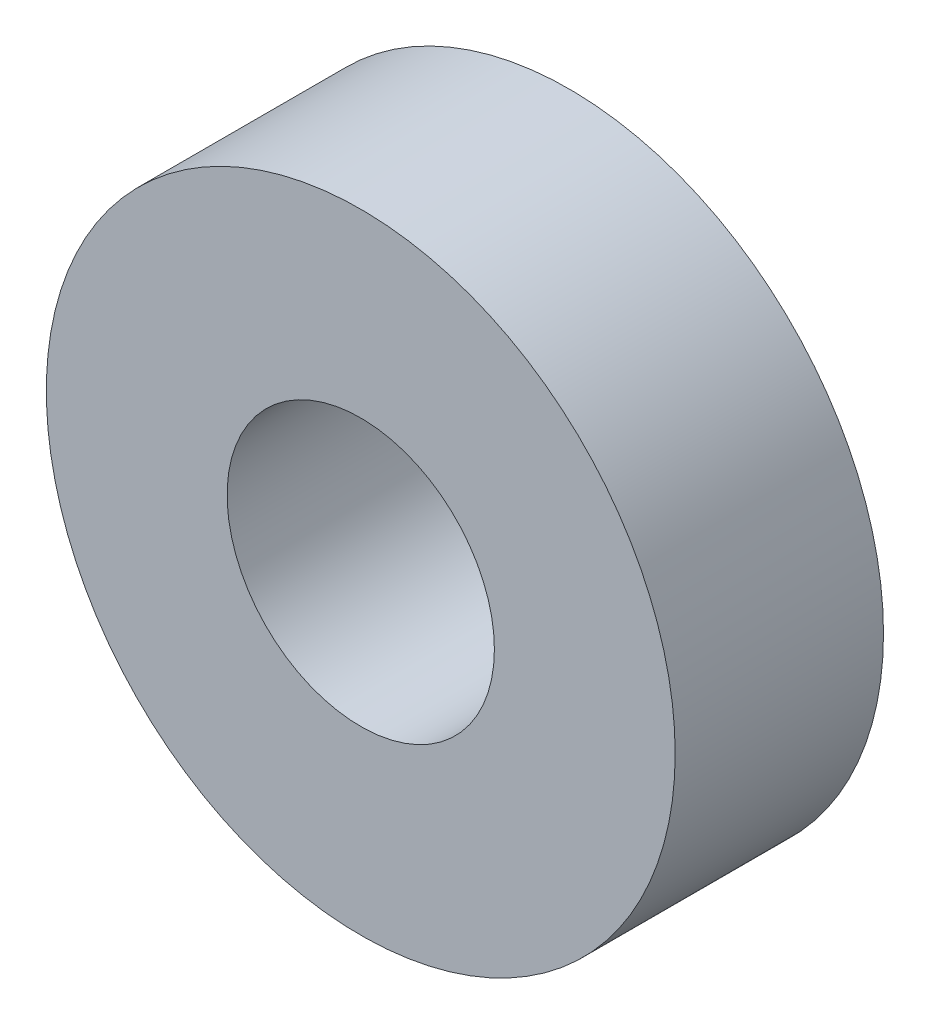
ISO-10303-21;
HEADER;
FILE_DESCRIPTION(('STEP AP214'),'2;1');
FILE_NAME('part.step','',(''),(''),'','','');
FILE_SCHEMA(('AUTOMOTIVE_DESIGN { 1 0 10303 214 1 1 1 1 }'));
ENDSEC;
DATA;
#1=APPLICATION_CONTEXT('core data for automotive mechanical design processes');
#2=APPLICATION_PROTOCOL_DEFINITION('international standard','automotive_design',2000,#1);
#3=PRODUCT_CONTEXT('',#1,'mechanical');
#4=PRODUCT('Part','Part','',(#3));
#5=PRODUCT_RELATED_PRODUCT_CATEGORY('part','',(#4));
#6=PRODUCT_DEFINITION_FORMATION('','',#4);
#7=PRODUCT_DEFINITION_CONTEXT('part definition',#1,'design');
#8=PRODUCT_DEFINITION('design','',#6,#7);
#9=PRODUCT_DEFINITION_SHAPE('','',#8);
#10=(LENGTH_UNIT() NAMED_UNIT(*) SI_UNIT(.MILLI.,.METRE.));
#11=(NAMED_UNIT(*) PLANE_ANGLE_UNIT() SI_UNIT($,.RADIAN.));
#12=(NAMED_UNIT(*) SI_UNIT($,.STERADIAN.) SOLID_ANGLE_UNIT());
#13=UNCERTAINTY_MEASURE_WITH_UNIT(LENGTH_MEASURE(1.E-05),#10,'distance_accuracy_value','');
#14=(GEOMETRIC_REPRESENTATION_CONTEXT(3) GLOBAL_UNCERTAINTY_ASSIGNED_CONTEXT((#13)) GLOBAL_UNIT_ASSIGNED_CONTEXT((#10,
#11,#12)) REPRESENTATION_CONTEXT('',''));
#15=CARTESIAN_POINT('',(0.,0.,0.));
#16=DIRECTION('',(0.,0.,1.));
#17=DIRECTION('',(1.,0.,0.));
#18=AXIS2_PLACEMENT_3D('',#15,#16,#17);
#19=CARTESIAN_POINT('',(0.,0.,13.25));
#20=DIRECTION('',(0.,0.,1.));
#21=DIRECTION('',(1.,0.,0.));
#22=AXIS2_PLACEMENT_3D('',#19,#20,#21);
#23=PLANE('',#22);
#24=CARTESIAN_POINT('',(0.,0.,13.25));
#25=DIRECTION('',(0.,0.,1.));
#26=DIRECTION('',(1.,0.,0.));
#27=AXIS2_PLACEMENT_3D('',#24,#25,#26);
#28=CIRCLE('',#27,20.);
#29=CARTESIAN_POINT('',(20.,0.,13.25));
#30=VERTEX_POINT('',#29);
#31=EDGE_CURVE('E10',#30,#30,#28,.T.);
#32=ORIENTED_EDGE('',*,*,#31,.T.);
#33=EDGE_LOOP('',(#32));
#34=FACE_BOUND('',#33,.T.);
#35=CARTESIAN_POINT('',(0.,0.,13.25));
#36=DIRECTION('',(0.,0.,1.));
#37=DIRECTION('',(1.,0.,0.));
#38=AXIS2_PLACEMENT_3D('',#35,#36,#37);
#39=CIRCLE('',#38,8.5);
#40=CARTESIAN_POINT('',(8.5,0.,13.25));
#41=VERTEX_POINT('',#40);
#42=EDGE_CURVE('E46',#41,#41,#39,.T.);
#43=ORIENTED_EDGE('',*,*,#42,.F.);
#44=EDGE_LOOP('',(#43));
#45=FACE_BOUND('',#44,.T.);
#46=ADVANCED_FACE('F35',(#34,#45),#23,.T.);
#47=CARTESIAN_POINT('',(0.,0.,0.));
#48=DIRECTION('',(0.,0.,1.));
#49=DIRECTION('',(1.,0.,0.));
#50=AXIS2_PLACEMENT_3D('',#47,#48,#49);
#51=PLANE('',#50);
#52=CARTESIAN_POINT('',(0.,0.,0.));
#53=DIRECTION('',(0.,0.,1.));
#54=DIRECTION('',(1.,0.,0.));
#55=AXIS2_PLACEMENT_3D('',#52,#53,#54);
#56=CIRCLE('',#55,20.);
#57=CARTESIAN_POINT('',(20.,0.,0.));
#58=VERTEX_POINT('',#57);
#59=EDGE_CURVE('E39',#58,#58,#56,.T.);
#60=ORIENTED_EDGE('',*,*,#59,.F.);
#61=EDGE_LOOP('',(#60));
#62=FACE_BOUND('',#61,.T.);
#63=CARTESIAN_POINT('',(0.,0.,0.));
#64=DIRECTION('',(0.,0.,1.));
#65=DIRECTION('',(1.,0.,0.));
#66=AXIS2_PLACEMENT_3D('',#63,#64,#65);
#67=CIRCLE('',#66,8.5);
#68=CARTESIAN_POINT('',(8.5,0.,0.));
#69=VERTEX_POINT('',#68);
#70=EDGE_CURVE('E48',#69,#69,#67,.T.);
#71=ORIENTED_EDGE('',*,*,#70,.T.);
#72=EDGE_LOOP('',(#71));
#73=FACE_BOUND('',#72,.T.);
#74=ADVANCED_FACE('F58',(#62,#73),#51,.F.);
#75=CARTESIAN_POINT('',(0.,0.,13.25));
#76=DIRECTION('',(0.,0.,-1.));
#77=DIRECTION('',(-1.,0.,0.));
#78=AXIS2_PLACEMENT_3D('',#75,#76,#77);
#79=CYLINDRICAL_SURFACE('',#78,20.);
#80=ORIENTED_EDGE('',*,*,#31,.F.);
#81=EDGE_LOOP('',(#80));
#82=FACE_BOUND('',#81,.T.);
#83=ORIENTED_EDGE('',*,*,#59,.T.);
#84=EDGE_LOOP('',(#83));
#85=FACE_BOUND('',#84,.T.);
#86=ADVANCED_FACE('F37',(#82,#85),#79,.T.);
#87=CARTESIAN_POINT('',(0.,0.,13.25));
#88=DIRECTION('',(0.,0.,-1.));
#89=DIRECTION('',(-1.,0.,0.));
#90=AXIS2_PLACEMENT_3D('',#87,#88,#89);
#91=CYLINDRICAL_SURFACE('',#90,8.5);
#92=ORIENTED_EDGE('',*,*,#42,.T.);
#93=EDGE_LOOP('',(#92));
#94=FACE_BOUND('',#93,.T.);
#95=ORIENTED_EDGE('',*,*,#70,.F.);
#96=EDGE_LOOP('',(#95));
#97=FACE_BOUND('',#96,.T.);
#98=ADVANCED_FACE('F54',(#94,#97),#91,.F.);
#99=CLOSED_SHELL('',(#46,#74,#86,#98));
#100=MANIFOLD_SOLID_BREP('B2',#99);
#101=ADVANCED_BREP_SHAPE_REPRESENTATION('',(#18,#100),#14);
#102=SHAPE_DEFINITION_REPRESENTATION(#9,#101);
ENDSEC;
END-ISO-10303-21;
